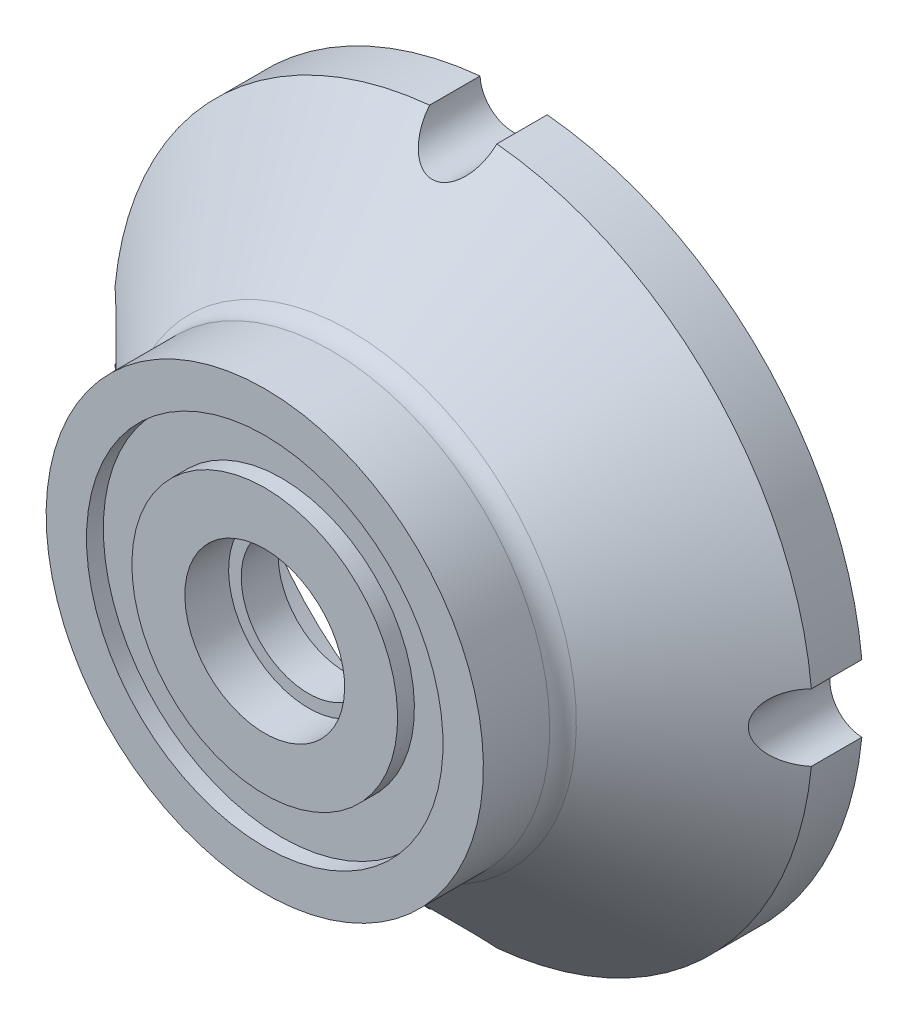
ISO-10303-21;
HEADER;
FILE_DESCRIPTION(('STEP AP214'),'2;1');
FILE_NAME('part.step','',(''),(''),'','','');
FILE_SCHEMA(('AUTOMOTIVE_DESIGN { 1 0 10303 214 1 1 1 1 }'));
ENDSEC;
DATA;
#1=APPLICATION_CONTEXT('core data for automotive mechanical design processes');
#2=APPLICATION_PROTOCOL_DEFINITION('international standard','automotive_design',2000,#1);
#3=PRODUCT_CONTEXT('',#1,'mechanical');
#4=PRODUCT('Part','Part','',(#3));
#5=PRODUCT_RELATED_PRODUCT_CATEGORY('part','',(#4));
#6=PRODUCT_DEFINITION_FORMATION('','',#4);
#7=PRODUCT_DEFINITION_CONTEXT('part definition',#1,'design');
#8=PRODUCT_DEFINITION('design','',#6,#7);
#9=PRODUCT_DEFINITION_SHAPE('','',#8);
#10=(LENGTH_UNIT() NAMED_UNIT(*) SI_UNIT(.MILLI.,.METRE.));
#11=(NAMED_UNIT(*) PLANE_ANGLE_UNIT() SI_UNIT($,.RADIAN.));
#12=(NAMED_UNIT(*) SI_UNIT($,.STERADIAN.) SOLID_ANGLE_UNIT());
#13=UNCERTAINTY_MEASURE_WITH_UNIT(LENGTH_MEASURE(1.E-05),#10,'distance_accuracy_value','');
#14=(GEOMETRIC_REPRESENTATION_CONTEXT(3) GLOBAL_UNCERTAINTY_ASSIGNED_CONTEXT((#13)) GLOBAL_UNIT_ASSIGNED_CONTEXT((#10,
#11,#12)) REPRESENTATION_CONTEXT('',''));
#15=CARTESIAN_POINT('',(0.,0.,0.));
#16=DIRECTION('',(0.,0.,1.));
#17=DIRECTION('',(1.,0.,0.));
#18=AXIS2_PLACEMENT_3D('',#15,#16,#17);
#19=CARTESIAN_POINT('',(0.,17.,0.));
#20=DIRECTION('',(0.,0.,-1.));
#21=DIRECTION('',(0.,1.,0.));
#22=AXIS2_PLACEMENT_3D('',#19,#20,#21);
#23=PLANE('',#22);
#24=CARTESIAN_POINT('',(0.,0.,0.));
#25=DIRECTION('',(0.,0.,-1.));
#26=DIRECTION('',(0.,1.,0.));
#27=AXIS2_PLACEMENT_3D('',#24,#25,#26);
#28=CIRCLE('',#27,17.);
#29=CARTESIAN_POINT('',(0.,17.,0.));
#30=VERTEX_POINT('',#29);
#31=EDGE_CURVE('E128',#30,#30,#28,.T.);
#32=ORIENTED_EDGE('',*,*,#31,.F.);
#33=EDGE_LOOP('',(#32));
#34=FACE_BOUND('',#33,.T.);
#35=CARTESIAN_POINT('',(0.,0.,0.));
#36=DIRECTION('',(0.,0.,-1.));
#37=DIRECTION('',(0.,1.,0.));
#38=AXIS2_PLACEMENT_3D('',#35,#36,#37);
#39=CIRCLE('',#38,20.8);
#40=CARTESIAN_POINT('',(-1.99768727229009,-20.7038461538462,0.));
#41=VERTEX_POINT('',#40);
#42=CARTESIAN_POINT('',(-20.7038461538462,-1.9976872722901,0.));
#43=VERTEX_POINT('',#42);
#44=EDGE_CURVE('E113',#41,#43,#39,.T.);
#45=ORIENTED_EDGE('',*,*,#44,.T.);
#46=CARTESIAN_POINT('',(-20.8,0.,0.));
#47=DIRECTION('',(0.,0.,1.));
#48=DIRECTION('',(1.,0.,0.));
#49=AXIS2_PLACEMENT_3D('',#46,#47,#48);
#50=CIRCLE('',#49,2.);
#51=CARTESIAN_POINT('',(-20.7038461538462,1.99768727229009,0.));
#52=VERTEX_POINT('',#51);
#53=EDGE_CURVE('E99',#43,#52,#50,.T.);
#54=ORIENTED_EDGE('',*,*,#53,.T.);
#55=CARTESIAN_POINT('',(-1.99768727229009,20.7038461538462,0.));
#56=VERTEX_POINT('',#55);
#57=EDGE_CURVE('E121',#52,#56,#39,.T.);
#58=ORIENTED_EDGE('',*,*,#57,.T.);
#59=CARTESIAN_POINT('',(0.,20.8,0.));
#60=DIRECTION('',(0.,0.,1.));
#61=DIRECTION('',(1.,0.,0.));
#62=AXIS2_PLACEMENT_3D('',#59,#60,#61);
#63=CIRCLE('',#62,2.);
#64=CARTESIAN_POINT('',(1.99768727229009,20.7038461538462,0.));
#65=VERTEX_POINT('',#64);
#66=EDGE_CURVE('E181',#56,#65,#63,.T.);
#67=ORIENTED_EDGE('',*,*,#66,.T.);
#68=CARTESIAN_POINT('',(20.7038461538462,1.99768727229009,0.));
#69=VERTEX_POINT('',#68);
#70=EDGE_CURVE('E123',#65,#69,#39,.T.);
#71=ORIENTED_EDGE('',*,*,#70,.T.);
#72=CARTESIAN_POINT('',(20.8,0.,0.));
#73=DIRECTION('',(0.,0.,1.));
#74=DIRECTION('',(1.,0.,0.));
#75=AXIS2_PLACEMENT_3D('',#72,#73,#74);
#76=CIRCLE('',#75,2.);
#77=CARTESIAN_POINT('',(20.7038461538462,-1.99768727229009,0.));
#78=VERTEX_POINT('',#77);
#79=EDGE_CURVE('E280',#69,#78,#76,.T.);
#80=ORIENTED_EDGE('',*,*,#79,.T.);
#81=CARTESIAN_POINT('',(1.99768727229009,-20.7038461538462,0.));
#82=VERTEX_POINT('',#81);
#83=EDGE_CURVE('E120',#78,#82,#39,.T.);
#84=ORIENTED_EDGE('',*,*,#83,.T.);
#85=CARTESIAN_POINT('',(0.,-20.8,0.));
#86=DIRECTION('',(0.,0.,1.));
#87=DIRECTION('',(1.,0.,0.));
#88=AXIS2_PLACEMENT_3D('',#85,#86,#87);
#89=CIRCLE('',#88,2.);
#90=EDGE_CURVE('E119',#82,#41,#89,.T.);
#91=ORIENTED_EDGE('',*,*,#90,.T.);
#92=EDGE_LOOP('',(#45,#54,#58,#67,#71,#80,#84,#91));
#93=FACE_BOUND('',#92,.T.);
#94=ADVANCED_FACE('F36',(#34,#93),#23,.T.);
#95=CARTESIAN_POINT('',(0.,0.,0.));
#96=DIRECTION('',(0.,0.,-1.));
#97=DIRECTION('',(0.,1.,0.));
#98=AXIS2_PLACEMENT_3D('',#95,#96,#97);
#99=CYLINDRICAL_SURFACE('',#98,20.8);
#100=ORIENTED_EDGE('',*,*,#57,.F.);
#101=DIRECTION('',(0.,0.,-1.));
#102=VECTOR('',#101,1.);
#103=CARTESIAN_POINT('',(-20.7038461538462,1.99768727229009,1.5));
#104=LINE('',#103,#102);
#105=CARTESIAN_POINT('',(-20.7038461538462,1.99768727229009,3.));
#106=VERTEX_POINT('',#105);
#107=EDGE_CURVE('E102',#106,#52,#104,.T.);
#108=ORIENTED_EDGE('',*,*,#107,.F.);
#109=CARTESIAN_POINT('',(0.,0.,3.));
#110=DIRECTION('',(0.,0.,-1.));
#111=DIRECTION('',(0.,1.,0.));
#112=AXIS2_PLACEMENT_3D('',#109,#110,#111);
#113=CIRCLE('',#112,20.8);
#114=CARTESIAN_POINT('',(-1.99768727229009,20.7038461538462,3.));
#115=VERTEX_POINT('',#114);
#116=EDGE_CURVE('E214',#106,#115,#113,.T.);
#117=ORIENTED_EDGE('',*,*,#116,.T.);
#118=DIRECTION('',(0.,0.,-1.));
#119=VECTOR('',#118,1.);
#120=CARTESIAN_POINT('',(-1.99768727229009,20.7038461538462,1.5));
#121=LINE('',#120,#119);
#122=EDGE_CURVE('E282',#56,#115,#121,.F.);
#123=ORIENTED_EDGE('',*,*,#122,.F.);
#124=EDGE_LOOP('',(#100,#108,#117,#123));
#125=FACE_BOUND('',#124,.T.);
#126=ADVANCED_FACE('F146',(#125),#99,.T.);
#127=CARTESIAN_POINT('',(-1.99768727229009,-20.7038461538462,2.99999999999999));
#128=VERTEX_POINT('',#127);
#129=CARTESIAN_POINT('',(-20.7038461538462,-1.9976872722901,3.));
#130=VERTEX_POINT('',#129);
#131=EDGE_CURVE('E115',#128,#130,#113,.T.);
#132=ORIENTED_EDGE('',*,*,#131,.T.);
#133=DIRECTION('',(0.,0.,-1.));
#134=VECTOR('',#133,1.);
#135=CARTESIAN_POINT('',(-20.7038461538462,-1.9976872722901,1.5));
#136=LINE('',#135,#134);
#137=EDGE_CURVE('E51',#43,#130,#136,.F.);
#138=ORIENTED_EDGE('',*,*,#137,.F.);
#139=ORIENTED_EDGE('',*,*,#44,.F.);
#140=DIRECTION('',(0.,0.,-1.));
#141=VECTOR('',#140,1.);
#142=CARTESIAN_POINT('',(-1.99768727229009,-20.7038461538462,1.49999999999999));
#143=LINE('',#142,#141);
#144=EDGE_CURVE('E256',#128,#41,#143,.T.);
#145=ORIENTED_EDGE('',*,*,#144,.F.);
#146=EDGE_LOOP('',(#132,#138,#139,#145));
#147=FACE_BOUND('',#146,.T.);
#148=ADVANCED_FACE('F111',(#147),#99,.T.);
#149=CARTESIAN_POINT('',(0.,0.,3.));
#150=DIRECTION('',(0.,0.,-1.));
#151=DIRECTION('',(0.,1.,0.));
#152=AXIS2_PLACEMENT_3D('',#149,#150,#151);
#153=CONICAL_SURFACE('',#152,20.8,0.825376850520738);
#154=CARTESIAN_POINT('',(0.,0.,9.75454168070733));
#155=DIRECTION('',(0.,0.,-1.));
#156=DIRECTION('',(0.,1.,0.));
#157=AXIS2_PLACEMENT_3D('',#154,#155,#156);
#158=CIRCLE('',#157,13.4825798459004);
#159=CARTESIAN_POINT('',(0.,13.4825798459004,9.75454168070733));
#160=VERTEX_POINT('',#159);
#161=EDGE_CURVE('E44',#160,#160,#158,.T.);
#162=ORIENTED_EDGE('',*,*,#161,.T.);
#163=EDGE_LOOP('',(#162));
#164=FACE_BOUND('',#163,.T.);
#165=ORIENTED_EDGE('',*,*,#116,.F.);
#166=CARTESIAN_POINT('',(-20.7040628216414,-1.99769768929351,2.99979999999988));
#167=CARTESIAN_POINT('',(-20.6423234101513,-1.99472479067877,3.05678797920817));
#168=CARTESIAN_POINT('',(-20.5807856851968,-1.98890831369218,3.11384678827432));
#169=CARTESIAN_POINT('',(-20.4583755671363,-1.97157901820399,3.22785604793121));
#170=CARTESIAN_POINT('',(-20.3975034171448,-1.96006418492685,3.2848064530388));
#171=CARTESIAN_POINT('',(-20.2762808754,-1.93122411643472,3.39873073057094));
#172=CARTESIAN_POINT('',(-20.2159377432615,-1.91385625667138,3.45570162042502));
#173=CARTESIAN_POINT('',(-20.0965722377513,-1.87327583124025,3.56890543829972));
#174=CARTESIAN_POINT('',(-20.0375497093545,-1.85006395556047,3.62513845261535));
#175=CARTESIAN_POINT('',(-19.8680144655603,-1.77378658498945,3.78738786029634));
#176=CARTESIAN_POINT('',(-19.7596229983857,-1.71279840853715,3.89204587578065));
#177=CARTESIAN_POINT('',(-19.5520388596017,-1.56798026172372,4.09411658067584));
#178=CARTESIAN_POINT('',(-19.4528226989133,-1.48421091056657,4.19154763705951));
#179=CARTESIAN_POINT('',(-19.2942419149139,-1.31975310301071,4.3484102573557));
#180=CARTESIAN_POINT('',(-19.2315896027621,-1.24502054119117,4.41074611743189));
#181=CARTESIAN_POINT('',(-19.1154827720173,-1.0827384537546,4.52680063936765));
#182=CARTESIAN_POINT('',(-19.0620158031844,-0.995206579828278,4.5805309587743));
#183=CARTESIAN_POINT('',(-18.9773730327602,-0.827577457426035,4.66590182247259));
#184=CARTESIAN_POINT('',(-18.9438743212939,-0.749820904137862,4.69981092709385));
#185=CARTESIAN_POINT('',(-18.8863080600481,-0.587517925823944,4.75820765335156));
#186=CARTESIAN_POINT('',(-18.8622340223379,-0.502976220167694,4.78270175604904));
#187=CARTESIAN_POINT('',(-18.8250956027797,-0.328294404026149,4.82053252989519));
#188=CARTESIAN_POINT('',(-18.8121196900427,-0.238115345994987,4.83377953841932));
#189=CARTESIAN_POINT('',(-18.798698886069,-0.0558771548957653,4.84748115356012));
#190=CARTESIAN_POINT('',(-18.7982460245694,0.0361807450458699,4.8479438966885));
#191=CARTESIAN_POINT('',(-18.8091474110555,0.207166391663922,4.83681382599125));
#192=CARTESIAN_POINT('',(-18.8190318348836,0.286296147201899,4.8267217591313));
#193=CARTESIAN_POINT('',(-18.8476788490582,0.441189355947289,4.79752261059754));
#194=CARTESIAN_POINT('',(-18.8664432031404,0.51695213713309,4.77841373800383));
#195=CARTESIAN_POINT('',(-18.912536790439,0.666185214739879,4.73158468099211));
#196=CARTESIAN_POINT('',(-18.9401467450416,0.739478312591064,4.70358256004766));
#197=CARTESIAN_POINT('',(-19.0023029575981,0.879881385781563,4.64073380637663));
#198=CARTESIAN_POINT('',(-19.0368526955397,0.946988234266243,4.60588373990617));
#199=CARTESIAN_POINT('',(-19.1325642413104,1.11039174584383,4.50967769130865));
#200=CARTESIAN_POINT('',(-19.1977990175731,1.20200905710495,4.44440218660916));
#201=CARTESIAN_POINT('',(-19.3382309842098,1.36938902333905,4.30477408645196));
#202=CARTESIAN_POINT('',(-19.4134542544447,1.44510878628785,4.23039777019588));
#203=CARTESIAN_POINT('',(-19.5998490087213,1.60619377580996,4.04735145064631));
#204=CARTESIAN_POINT('',(-19.7141210625072,1.68499445864494,3.93607188475805));
#205=CARTESIAN_POINT('',(-19.9512749630087,1.81604931058751,3.70736957177021));
#206=CARTESIAN_POINT('',(-20.0741638218788,1.86828156683718,3.58994184159066));
#207=CARTESIAN_POINT('',(-20.2821569299218,1.93373075021368,3.39311701050383));
#208=CARTESIAN_POINT('',(-20.3657837152277,1.9541834707449,3.31447222416467));
#209=CARTESIAN_POINT('',(-20.5341656401169,1.98408131828427,3.15710927358457));
#210=CARTESIAN_POINT('',(-20.6189135566512,1.99357813787402,3.0783932223058));
#211=CARTESIAN_POINT('',(-20.7040628216414,1.9976976892935,2.99979999999987));
#212=B_SPLINE_CURVE_WITH_KNOTS('',3,(#166,#167,#168,#169,#170,#171,#172,#173,#174,#175,#176,
#177,#178,#179,#180,#181,#182,#183,#184,#185,#186,#187,#188,#189,#190,#191,#192,#193,#194,#195,
#196,#197,#198,#199,#200,#201,#202,#203,#204,#205,#206,#207,#208,#209,#210,#211),.UNSPECIFIED.,
.F.,.F.,(4,2,2,2,2,2,2,2,2,2,2,2,2,2,2,2,2,2,2,2,2,2,4),(0.,0.252169415062769,0.504428053777322,
0.758564952672955,1.01267186033474,1.49847297536855,1.98299384460009,2.3291035942886,
2.67474044454704,2.94730289739613,3.21967738734604,3.49420340545444,3.76855469818095,
4.00858834994238,4.24866969732025,4.4972844215902,4.74602412755156,5.13395487578811,
5.5229191907289,6.05383308119859,6.58518414671709,6.93451241536415,7.28218563970306),.UNSPECIFIED.);
#213=EDGE_CURVE('E106',#130,#106,#212,.T.);
#214=ORIENTED_EDGE('',*,*,#213,.F.);
#215=ORIENTED_EDGE('',*,*,#131,.F.);
#216=CARTESIAN_POINT('',(1.9976976892935,-20.7040628216414,2.99979999999988));
#217=CARTESIAN_POINT('',(1.99472479067877,-20.6423234101513,3.05678797920817));
#218=CARTESIAN_POINT('',(1.98890831369218,-20.5807856851968,3.11384678827433));
#219=CARTESIAN_POINT('',(1.97157901820398,-20.4583755671363,3.22785604793121));
#220=CARTESIAN_POINT('',(1.96006418492684,-20.3975034171448,3.2848064530388));
#221=CARTESIAN_POINT('',(1.93122411643472,-20.2762808754,3.39873073057094));
#222=CARTESIAN_POINT('',(1.91385625667137,-20.2159377432615,3.45570162042502));
#223=CARTESIAN_POINT('',(1.87327583124024,-20.0965722377513,3.56890543829972));
#224=CARTESIAN_POINT('',(1.85006395556046,-20.0375497093545,3.62513845261535));
#225=CARTESIAN_POINT('',(1.77378658498944,-19.8680144655603,3.78738786029634));
#226=CARTESIAN_POINT('',(1.71279840853715,-19.7596229983857,3.89204587578065));
#227=CARTESIAN_POINT('',(1.56798026172372,-19.5520388596017,4.09411658067584));
#228=CARTESIAN_POINT('',(1.48421091056656,-19.4528226989133,4.19154763705951));
#229=CARTESIAN_POINT('',(1.31975310301071,-19.2942419149139,4.34841025735569));
#230=CARTESIAN_POINT('',(1.24502054119116,-19.2315896027621,4.41074611743188));
#231=CARTESIAN_POINT('',(1.08273845375459,-19.1154827720173,4.52680063936764));
#232=CARTESIAN_POINT('',(0.995206579828275,-19.0620158031844,4.58053095877429));
#233=CARTESIAN_POINT('',(0.827577457426032,-18.9773730327602,4.66590182247258));
#234=CARTESIAN_POINT('',(0.749820904137859,-18.9438743212939,4.69981092709385));
#235=CARTESIAN_POINT('',(0.58751792582394,-18.8863080600481,4.75820765335155));
#236=CARTESIAN_POINT('',(0.502976220167691,-18.8622340223379,4.78270175604903));
#237=CARTESIAN_POINT('',(0.328294404026147,-18.8250956027797,4.82053252989519));
#238=CARTESIAN_POINT('',(0.238115345994985,-18.8121196900427,4.83377953841932));
#239=CARTESIAN_POINT('',(0.0558771548957623,-18.798698886069,4.84748115356011));
#240=CARTESIAN_POINT('',(-0.0361807450458734,-18.7982460245694,4.84794389668849));
#241=CARTESIAN_POINT('',(-0.207166391663926,-18.8091474110555,4.83681382599124));
#242=CARTESIAN_POINT('',(-0.286296147201903,-18.8190318348836,4.8267217591313));
#243=CARTESIAN_POINT('',(-0.441189355947292,-18.8476788490582,4.79752261059753));
#244=CARTESIAN_POINT('',(-0.516952137133093,-18.8664432031404,4.77841373800382));
#245=CARTESIAN_POINT('',(-0.666185214739881,-18.9125367904391,4.73158468099211));
#246=CARTESIAN_POINT('',(-0.739478312591066,-18.9401467450416,4.70358256004766));
#247=CARTESIAN_POINT('',(-0.879881385781565,-19.0023029575981,4.64073380637663));
#248=CARTESIAN_POINT('',(-0.946988234266244,-19.0368526955397,4.60588373990616));
#249=CARTESIAN_POINT('',(-1.11039174584383,-19.1325642413104,4.50967769130864));
#250=CARTESIAN_POINT('',(-1.20200905710495,-19.1977990175731,4.44440218660915));
#251=CARTESIAN_POINT('',(-1.36938902333905,-19.3382309842098,4.30477408645195));
#252=CARTESIAN_POINT('',(-1.44510878628785,-19.4134542544447,4.23039777019587));
#253=CARTESIAN_POINT('',(-1.60619377580996,-19.5998490087213,4.0473514506463));
#254=CARTESIAN_POINT('',(-1.68499445864495,-19.7141210625072,3.93607188475804));
#255=CARTESIAN_POINT('',(-1.81604931058751,-19.9512749630087,3.7073695717702));
#256=CARTESIAN_POINT('',(-1.86828156683718,-20.0741638218789,3.58994184159065));
#257=CARTESIAN_POINT('',(-1.93373075021368,-20.2821569299218,3.39311701050382));
#258=CARTESIAN_POINT('',(-1.9541834707449,-20.3657837152277,3.31447222416466));
#259=CARTESIAN_POINT('',(-1.98408131828427,-20.5341656401169,3.15710927358456));
#260=CARTESIAN_POINT('',(-1.99357813787402,-20.6189135566512,3.0783932223058));
#261=CARTESIAN_POINT('',(-1.9976976892935,-20.7040628216414,2.99979999999987));
#262=B_SPLINE_CURVE_WITH_KNOTS('',3,(#216,#217,#218,#219,#220,#221,#222,#223,#224,#225,#226,
#227,#228,#229,#230,#231,#232,#233,#234,#235,#236,#237,#238,#239,#240,#241,#242,#243,#244,#245,
#246,#247,#248,#249,#250,#251,#252,#253,#254,#255,#256,#257,#258,#259,#260,#261),.UNSPECIFIED.,
.F.,.F.,(4,2,2,2,2,2,2,2,2,2,2,2,2,2,2,2,2,2,2,2,2,2,4),(0.,0.25216941506277,0.504428053777323,
0.758564952672958,1.01267186033474,1.49847297536855,1.98299384460009,2.3291035942886,
2.67474044454703,2.94730289739612,3.21967738734604,3.49420340545443,3.76855469818094,
4.00858834994237,4.24866969732024,4.4972844215902,4.74602412755155,5.1339548757881,
5.52291919072889,6.05383308119858,6.58518414671709,6.93451241536414,7.28218563970304),.UNSPECIFIED.);
#263=CARTESIAN_POINT('',(1.99768727229009,-20.7038461538462,2.99999999999999));
#264=VERTEX_POINT('',#263);
#265=EDGE_CURVE('E233',#264,#128,#262,.T.);
#266=ORIENTED_EDGE('',*,*,#265,.F.);
#267=CARTESIAN_POINT('',(20.7038461538462,-1.99768727229009,3.));
#268=VERTEX_POINT('',#267);
#269=EDGE_CURVE('E220',#268,#264,#113,.T.);
#270=ORIENTED_EDGE('',*,*,#269,.F.);
#271=CARTESIAN_POINT('',(20.7040628216414,1.99769768929351,2.99979999999988));
#272=CARTESIAN_POINT('',(20.6423234101513,1.99472479067877,3.05678797920817));
#273=CARTESIAN_POINT('',(20.5807856851968,1.98890831369218,3.11384678827433));
#274=CARTESIAN_POINT('',(20.4583755671363,1.97157901820399,3.22785604793121));
#275=CARTESIAN_POINT('',(20.3975034171448,1.96006418492685,3.2848064530388));
#276=CARTESIAN_POINT('',(20.2762808754,1.93122411643472,3.39873073057094));
#277=CARTESIAN_POINT('',(20.2159377432615,1.91385625667138,3.45570162042502));
#278=CARTESIAN_POINT('',(20.0965722377513,1.87327583124024,3.56890543829972));
#279=CARTESIAN_POINT('',(20.0375497093545,1.85006395556047,3.62513845261535));
#280=CARTESIAN_POINT('',(19.8680144655603,1.77378658498944,3.78738786029634));
#281=CARTESIAN_POINT('',(19.7596229983857,1.71279840853715,3.89204587578065));
#282=CARTESIAN_POINT('',(19.5520388596017,1.56798026172372,4.09411658067584));
#283=CARTESIAN_POINT('',(19.4528226989133,1.48421091056656,4.19154763705951));
#284=CARTESIAN_POINT('',(19.2942419149139,1.31975310301071,4.3484102573557));
#285=CARTESIAN_POINT('',(19.2315896027621,1.24502054119116,4.41074611743188));
#286=CARTESIAN_POINT('',(19.1154827720173,1.08273845375459,4.52680063936765));
#287=CARTESIAN_POINT('',(19.0620158031844,0.995206579828276,4.5805309587743));
#288=CARTESIAN_POINT('',(18.9773730327602,0.827577457426033,4.66590182247259));
#289=CARTESIAN_POINT('',(18.9438743212939,0.749820904137859,4.69981092709385));
#290=CARTESIAN_POINT('',(18.8863080600481,0.587517925823941,4.75820765335156));
#291=CARTESIAN_POINT('',(18.8622340223379,0.502976220167693,4.78270175604904));
#292=CARTESIAN_POINT('',(18.8250956027797,0.328294404026149,4.82053252989519));
#293=CARTESIAN_POINT('',(18.8121196900427,0.238115345994986,4.83377953841932));
#294=CARTESIAN_POINT('',(18.798698886069,0.0558771548957641,4.84748115356012));
#295=CARTESIAN_POINT('',(18.7982460245694,-0.0361807450458712,4.8479438966885));
#296=CARTESIAN_POINT('',(18.8091474110555,-0.207166391663923,4.83681382599125));
#297=CARTESIAN_POINT('',(18.8190318348836,-0.2862961472019,4.8267217591313));
#298=CARTESIAN_POINT('',(18.8476788490582,-0.44118935594729,4.79752261059754));
#299=CARTESIAN_POINT('',(18.8664432031404,-0.516952137133091,4.77841373800383));
#300=CARTESIAN_POINT('',(18.912536790439,-0.66618521473988,4.73158468099211));
#301=CARTESIAN_POINT('',(18.9401467450416,-0.739478312591065,4.70358256004766));
#302=CARTESIAN_POINT('',(19.0023029575981,-0.879881385781564,4.64073380637663));
#303=CARTESIAN_POINT('',(19.0368526955397,-0.946988234266243,4.60588373990617));
#304=CARTESIAN_POINT('',(19.1325642413104,-1.11039174584383,4.50967769130865));
#305=CARTESIAN_POINT('',(19.1977990175731,-1.20200905710495,4.44440218660916));
#306=CARTESIAN_POINT('',(19.3382309842098,-1.36938902333905,4.30477408645196));
#307=CARTESIAN_POINT('',(19.4134542544447,-1.44510878628785,4.23039777019588));
#308=CARTESIAN_POINT('',(19.5998490087213,-1.60619377580996,4.04735145064631));
#309=CARTESIAN_POINT('',(19.7141210625072,-1.68499445864495,3.93607188475805));
#310=CARTESIAN_POINT('',(19.9512749630087,-1.81604931058751,3.70736957177021));
#311=CARTESIAN_POINT('',(20.0741638218788,-1.86828156683718,3.58994184159066));
#312=CARTESIAN_POINT('',(20.2821569299218,-1.93373075021368,3.39311701050383));
#313=CARTESIAN_POINT('',(20.3657837152277,-1.9541834707449,3.31447222416467));
#314=CARTESIAN_POINT('',(20.5341656401169,-1.98408131828428,3.15710927358457));
#315=CARTESIAN_POINT('',(20.6189135566512,-1.99357813787402,3.0783932223058));
#316=CARTESIAN_POINT('',(20.7040628216414,-1.9976976892935,2.99979999999987));
#317=B_SPLINE_CURVE_WITH_KNOTS('',3,(#271,#272,#273,#274,#275,#276,#277,#278,#279,#280,#281,
#282,#283,#284,#285,#286,#287,#288,#289,#290,#291,#292,#293,#294,#295,#296,#297,#298,#299,#300,
#301,#302,#303,#304,#305,#306,#307,#308,#309,#310,#311,#312,#313,#314,#315,#316),.UNSPECIFIED.,
.F.,.F.,(4,2,2,2,2,2,2,2,2,2,2,2,2,2,2,2,2,2,2,2,2,2,4),(0.,0.252169415062768,0.504428053777322,
0.758564952672955,1.01267186033474,1.49847297536855,1.98299384460009,2.3291035942886,
2.67474044454704,2.94730289739613,3.21967738734604,3.49420340545444,3.76855469818095,
4.00858834994238,4.24866969732024,4.4972844215902,4.74602412755156,5.1339548757881,
5.5229191907289,6.05383308119859,6.58518414671709,6.93451241536414,7.28218563970306),.UNSPECIFIED.);
#318=CARTESIAN_POINT('',(20.7038461538462,1.99768727229009,3.));
#319=VERTEX_POINT('',#318);
#320=EDGE_CURVE('E232',#319,#268,#317,.T.);
#321=ORIENTED_EDGE('',*,*,#320,.F.);
#322=CARTESIAN_POINT('',(1.99768727229009,20.7038461538462,3.));
#323=VERTEX_POINT('',#322);
#324=EDGE_CURVE('E124',#323,#319,#113,.T.);
#325=ORIENTED_EDGE('',*,*,#324,.F.);
#326=CARTESIAN_POINT('',(-1.9976976892935,20.7040628216414,2.99979999999988));
#327=CARTESIAN_POINT('',(-1.99472479067876,20.6423234101513,3.05678797920817));
#328=CARTESIAN_POINT('',(-1.98890831369217,20.5807856851968,3.11384678827433));
#329=CARTESIAN_POINT('',(-1.97157901820398,20.4583755671363,3.22785604793121));
#330=CARTESIAN_POINT('',(-1.96006418492684,20.3975034171448,3.2848064530388));
#331=CARTESIAN_POINT('',(-1.93122411643472,20.2762808754,3.39873073057094));
#332=CARTESIAN_POINT('',(-1.91385625667137,20.2159377432615,3.45570162042503));
#333=CARTESIAN_POINT('',(-1.87327583124024,20.0965722377513,3.56890543829973));
#334=CARTESIAN_POINT('',(-1.85006395556046,20.0375497093545,3.62513845261535));
#335=CARTESIAN_POINT('',(-1.77378658498944,19.8680144655603,3.78738786029634));
#336=CARTESIAN_POINT('',(-1.71279840853715,19.7596229983857,3.89204587578065));
#337=CARTESIAN_POINT('',(-1.56798026172372,19.5520388596017,4.09411658067584));
#338=CARTESIAN_POINT('',(-1.48421091056656,19.4528226989133,4.19154763705951));
#339=CARTESIAN_POINT('',(-1.3197531030107,19.2942419149139,4.3484102573557));
#340=CARTESIAN_POINT('',(-1.24502054119116,19.2315896027621,4.41074611743189));
#341=CARTESIAN_POINT('',(-1.08273845375459,19.1154827720173,4.52680063936765));
#342=CARTESIAN_POINT('',(-0.995206579828273,19.0620158031844,4.5805309587743));
#343=CARTESIAN_POINT('',(-0.82757745742603,18.9773730327602,4.66590182247259));
#344=CARTESIAN_POINT('',(-0.749820904137857,18.9438743212939,4.69981092709385));
#345=CARTESIAN_POINT('',(-0.587517925823938,18.8863080600481,4.75820765335156));
#346=CARTESIAN_POINT('',(-0.50297622016769,18.8622340223379,4.78270175604904));
#347=CARTESIAN_POINT('',(-0.328294404026145,18.8250956027797,4.82053252989519));
#348=CARTESIAN_POINT('',(-0.238115345994983,18.8121196900427,4.83377953841932));
#349=CARTESIAN_POINT('',(-0.055877154895761,18.798698886069,4.84748115356012));
#350=CARTESIAN_POINT('',(0.0361807450458744,18.7982460245694,4.8479438966885));
#351=CARTESIAN_POINT('',(0.207166391663927,18.8091474110555,4.83681382599125));
#352=CARTESIAN_POINT('',(0.286296147201903,18.8190318348836,4.8267217591313));
#353=CARTESIAN_POINT('',(0.441189355947293,18.8476788490582,4.79752261059754));
#354=CARTESIAN_POINT('',(0.516952137133094,18.8664432031404,4.77841373800383));
#355=CARTESIAN_POINT('',(0.666185214739883,18.912536790439,4.73158468099211));
#356=CARTESIAN_POINT('',(0.739478312591067,18.9401467450416,4.70358256004766));
#357=CARTESIAN_POINT('',(0.879881385781566,19.0023029575981,4.64073380637663));
#358=CARTESIAN_POINT('',(0.946988234266245,19.0368526955397,4.60588373990617));
#359=CARTESIAN_POINT('',(1.11039174584383,19.1325642413104,4.50967769130865));
#360=CARTESIAN_POINT('',(1.20200905710495,19.1977990175731,4.44440218660916));
#361=CARTESIAN_POINT('',(1.36938902333905,19.3382309842098,4.30477408645196));
#362=CARTESIAN_POINT('',(1.44510878628785,19.4134542544447,4.23039777019588));
#363=CARTESIAN_POINT('',(1.60619377580996,19.5998490087213,4.04735145064631));
#364=CARTESIAN_POINT('',(1.68499445864495,19.7141210625072,3.93607188475805));
#365=CARTESIAN_POINT('',(1.81604931058751,19.9512749630087,3.70736957177021));
#366=CARTESIAN_POINT('',(1.86828156683718,20.0741638218788,3.58994184159066));
#367=CARTESIAN_POINT('',(1.93373075021368,20.2821569299218,3.39311701050383));
#368=CARTESIAN_POINT('',(1.9541834707449,20.3657837152277,3.31447222416467));
#369=CARTESIAN_POINT('',(1.98408131828428,20.5341656401169,3.15710927358456));
#370=CARTESIAN_POINT('',(1.99357813787402,20.6189135566512,3.0783932223058));
#371=CARTESIAN_POINT('',(1.9976976892935,20.7040628216414,2.99979999999987));
#372=B_SPLINE_CURVE_WITH_KNOTS('',3,(#326,#327,#328,#329,#330,#331,#332,#333,#334,#335,#336,
#337,#338,#339,#340,#341,#342,#343,#344,#345,#346,#347,#348,#349,#350,#351,#352,#353,#354,#355,
#356,#357,#358,#359,#360,#361,#362,#363,#364,#365,#366,#367,#368,#369,#370,#371),.UNSPECIFIED.,
.F.,.F.,(4,2,2,2,2,2,2,2,2,2,2,2,2,2,2,2,2,2,2,2,2,2,4),(0.,0.252169415062771,0.504428053777322,
0.758564952672956,1.01267186033474,1.49847297536855,1.98299384460009,2.3291035942886,
2.67474044454704,2.94730289739613,3.21967738734604,3.49420340545444,3.76855469818095,
4.00858834994238,4.24866969732024,4.4972844215902,4.74602412755156,5.1339548757881,
5.52291919072889,6.05383308119858,6.58518414671709,6.93451241536414,7.28218563970306),.UNSPECIFIED.);
#373=EDGE_CURVE('E176',#115,#323,#372,.T.);
#374=ORIENTED_EDGE('',*,*,#373,.F.);
#375=EDGE_LOOP('',(#165,#214,#215,#266,#270,#321,#325,#374));
#376=FACE_BOUND('',#375,.T.);
#377=ADVANCED_FACE('F134',(#164,#376),#153,.T.);
#378=ORIENTED_EDGE('',*,*,#269,.T.);
#379=DIRECTION('',(0.,0.,-1.));
#380=VECTOR('',#379,1.);
#381=CARTESIAN_POINT('',(1.99768727229009,-20.7038461538462,1.49999999999999));
#382=LINE('',#381,#380);
#383=EDGE_CURVE('E59',#82,#264,#382,.F.);
#384=ORIENTED_EDGE('',*,*,#383,.F.);
#385=ORIENTED_EDGE('',*,*,#83,.F.);
#386=DIRECTION('',(0.,0.,-1.));
#387=VECTOR('',#386,1.);
#388=CARTESIAN_POINT('',(20.7038461538462,-1.99768727229009,1.5));
#389=LINE('',#388,#387);
#390=EDGE_CURVE('E230',#268,#78,#389,.T.);
#391=ORIENTED_EDGE('',*,*,#390,.F.);
#392=EDGE_LOOP('',(#378,#384,#385,#391));
#393=FACE_BOUND('',#392,.T.);
#394=ADVANCED_FACE('F168',(#393),#99,.T.);
#395=ORIENTED_EDGE('',*,*,#324,.T.);
#396=DIRECTION('',(0.,0.,-1.));
#397=VECTOR('',#396,1.);
#398=CARTESIAN_POINT('',(20.7038461538462,1.99768727229009,1.5));
#399=LINE('',#398,#397);
#400=EDGE_CURVE('E235',#69,#319,#399,.F.);
#401=ORIENTED_EDGE('',*,*,#400,.F.);
#402=ORIENTED_EDGE('',*,*,#70,.F.);
#403=DIRECTION('',(0.,0.,-1.));
#404=VECTOR('',#403,1.);
#405=CARTESIAN_POINT('',(1.99768727229009,20.7038461538462,1.5));
#406=LINE('',#405,#404);
#407=EDGE_CURVE('E279',#323,#65,#406,.T.);
#408=ORIENTED_EDGE('',*,*,#407,.F.);
#409=EDGE_LOOP('',(#395,#401,#402,#408));
#410=FACE_BOUND('',#409,.T.);
#411=ADVANCED_FACE('F154',(#410),#99,.T.);
#412=CARTESIAN_POINT('',(0.,0.,0.));
#413=DIRECTION('',(0.,0.,-1.));
#414=DIRECTION('',(0.,1.,0.));
#415=AXIS2_PLACEMENT_3D('',#412,#413,#414);
#416=CYLINDRICAL_SURFACE('',#415,17.);
#417=ORIENTED_EDGE('',*,*,#31,.T.);
#418=EDGE_LOOP('',(#417));
#419=FACE_BOUND('',#418,.T.);
#420=CARTESIAN_POINT('',(0.,0.,4.2));
#421=DIRECTION('',(0.,0.,-1.));
#422=DIRECTION('',(0.,1.,0.));
#423=AXIS2_PLACEMENT_3D('',#420,#421,#422);
#424=CIRCLE('',#423,17.);
#425=CARTESIAN_POINT('',(0.,17.,4.2));
#426=VERTEX_POINT('',#425);
#427=EDGE_CURVE('E173',#426,#426,#424,.T.);
#428=ORIENTED_EDGE('',*,*,#427,.F.);
#429=EDGE_LOOP('',(#428));
#430=FACE_BOUND('',#429,.T.);
#431=ADVANCED_FACE('F157',(#419,#430),#416,.F.);
#432=CARTESIAN_POINT('',(0.,0.,0.));
#433=DIRECTION('',(0.,0.,-1.));
#434=DIRECTION('',(0.,1.,0.));
#435=AXIS2_PLACEMENT_3D('',#432,#433,#434);
#436=CYLINDRICAL_SURFACE('',#435,13.);
#437=CARTESIAN_POINT('',(0.,0.,10.8567468476486));
#438=DIRECTION('',(0.,0.,-1.));
#439=DIRECTION('',(0.,1.,0.));
#440=AXIS2_PLACEMENT_3D('',#437,#438,#439);
#441=CIRCLE('',#440,13.);
#442=CARTESIAN_POINT('',(0.,13.,10.8567468476486));
#443=VERTEX_POINT('',#442);
#444=EDGE_CURVE('E11',#443,#443,#441,.F.);
#445=ORIENTED_EDGE('',*,*,#444,.T.);
#446=EDGE_LOOP('',(#445));
#447=FACE_BOUND('',#446,.T.);
#448=CARTESIAN_POINT('',(0.,0.,14.8));
#449=DIRECTION('',(0.,0.,-1.));
#450=DIRECTION('',(0.,1.,0.));
#451=AXIS2_PLACEMENT_3D('',#448,#449,#450);
#452=CIRCLE('',#451,13.);
#453=CARTESIAN_POINT('',(0.,13.,14.8));
#454=VERTEX_POINT('',#453);
#455=EDGE_CURVE('E212',#454,#454,#452,.T.);
#456=ORIENTED_EDGE('',*,*,#455,.T.);
#457=EDGE_LOOP('',(#456));
#458=FACE_BOUND('',#457,.T.);
#459=ADVANCED_FACE('F159',(#447,#458),#436,.T.);
#460=CARTESIAN_POINT('',(0.,13.,14.8));
#461=DIRECTION('',(0.,0.,1.));
#462=DIRECTION('',(0.,-1.,0.));
#463=AXIS2_PLACEMENT_3D('',#460,#461,#462);
#464=PLANE('',#463);
#465=CARTESIAN_POINT('',(0.,0.,14.8));
#466=DIRECTION('',(0.,0.,-1.));
#467=DIRECTION('',(0.,1.,0.));
#468=AXIS2_PLACEMENT_3D('',#465,#466,#467);
#469=CIRCLE('',#468,10.6);
#470=CARTESIAN_POINT('',(0.,10.6,14.8));
#471=VERTEX_POINT('',#470);
#472=EDGE_CURVE('E210',#471,#471,#469,.T.);
#473=ORIENTED_EDGE('',*,*,#472,.T.);
#474=EDGE_LOOP('',(#473));
#475=FACE_BOUND('',#474,.T.);
#476=ORIENTED_EDGE('',*,*,#455,.F.);
#477=EDGE_LOOP('',(#476));
#478=FACE_BOUND('',#477,.T.);
#479=ADVANCED_FACE('F165',(#475,#478),#464,.T.);
#480=CARTESIAN_POINT('',(0.,0.,0.));
#481=DIRECTION('',(0.,0.,-1.));
#482=DIRECTION('',(0.,1.,0.));
#483=AXIS2_PLACEMENT_3D('',#480,#481,#482);
#484=CYLINDRICAL_SURFACE('',#483,10.6);
#485=CARTESIAN_POINT('',(0.,0.,13.8));
#486=DIRECTION('',(0.,0.,-1.));
#487=DIRECTION('',(0.,1.,0.));
#488=AXIS2_PLACEMENT_3D('',#485,#486,#487);
#489=CIRCLE('',#488,10.6);
#490=CARTESIAN_POINT('',(0.,10.6,13.8));
#491=VERTEX_POINT('',#490);
#492=EDGE_CURVE('E207',#491,#491,#489,.T.);
#493=ORIENTED_EDGE('',*,*,#492,.T.);
#494=EDGE_LOOP('',(#493));
#495=FACE_BOUND('',#494,.T.);
#496=ORIENTED_EDGE('',*,*,#472,.F.);
#497=EDGE_LOOP('',(#496));
#498=FACE_BOUND('',#497,.T.);
#499=ADVANCED_FACE('F320',(#495,#498),#484,.F.);
#500=CARTESIAN_POINT('',(0.,10.6,13.8));
#501=DIRECTION('',(0.,0.,1.));
#502=DIRECTION('',(0.,-1.,0.));
#503=AXIS2_PLACEMENT_3D('',#500,#501,#502);
#504=PLANE('',#503);
#505=CARTESIAN_POINT('',(0.,0.,13.8));
#506=DIRECTION('',(0.,0.,-1.));
#507=DIRECTION('',(0.,1.,0.));
#508=AXIS2_PLACEMENT_3D('',#505,#506,#507);
#509=CIRCLE('',#508,7.9);
#510=CARTESIAN_POINT('',(0.,7.9,13.8));
#511=VERTEX_POINT('',#510);
#512=EDGE_CURVE('E204',#511,#511,#509,.T.);
#513=ORIENTED_EDGE('',*,*,#512,.T.);
#514=EDGE_LOOP('',(#513));
#515=FACE_BOUND('',#514,.T.);
#516=ORIENTED_EDGE('',*,*,#492,.F.);
#517=EDGE_LOOP('',(#516));
#518=FACE_BOUND('',#517,.T.);
#519=ADVANCED_FACE('F316',(#515,#518),#504,.T.);
#520=CARTESIAN_POINT('',(0.,0.,0.));
#521=DIRECTION('',(0.,0.,-1.));
#522=DIRECTION('',(0.,1.,0.));
#523=AXIS2_PLACEMENT_3D('',#520,#521,#522);
#524=CYLINDRICAL_SURFACE('',#523,7.9);
#525=CARTESIAN_POINT('',(0.,0.,14.8));
#526=DIRECTION('',(0.,0.,-1.));
#527=DIRECTION('',(0.,1.,0.));
#528=AXIS2_PLACEMENT_3D('',#525,#526,#527);
#529=CIRCLE('',#528,7.9);
#530=CARTESIAN_POINT('',(0.,7.9,14.8));
#531=VERTEX_POINT('',#530);
#532=EDGE_CURVE('E201',#531,#531,#529,.T.);
#533=ORIENTED_EDGE('',*,*,#532,.T.);
#534=EDGE_LOOP('',(#533));
#535=FACE_BOUND('',#534,.T.);
#536=ORIENTED_EDGE('',*,*,#512,.F.);
#537=EDGE_LOOP('',(#536));
#538=FACE_BOUND('',#537,.T.);
#539=ADVANCED_FACE('F312',(#535,#538),#524,.T.);
#540=CARTESIAN_POINT('',(0.,7.9,14.8));
#541=DIRECTION('',(0.,0.,1.));
#542=DIRECTION('',(0.,-1.,0.));
#543=AXIS2_PLACEMENT_3D('',#540,#541,#542);
#544=PLANE('',#543);
#545=CARTESIAN_POINT('',(0.,0.,14.8));
#546=DIRECTION('',(0.,0.,-1.));
#547=DIRECTION('',(0.,1.,0.));
#548=AXIS2_PLACEMENT_3D('',#545,#546,#547);
#549=CIRCLE('',#548,4.75);
#550=CARTESIAN_POINT('',(0.,4.75,14.8));
#551=VERTEX_POINT('',#550);
#552=EDGE_CURVE('E198',#551,#551,#549,.T.);
#553=ORIENTED_EDGE('',*,*,#552,.T.);
#554=EDGE_LOOP('',(#553));
#555=FACE_BOUND('',#554,.T.);
#556=ORIENTED_EDGE('',*,*,#532,.F.);
#557=EDGE_LOOP('',(#556));
#558=FACE_BOUND('',#557,.T.);
#559=ADVANCED_FACE('F308',(#555,#558),#544,.T.);
#560=CARTESIAN_POINT('',(0.,0.,0.));
#561=DIRECTION('',(0.,0.,-1.));
#562=DIRECTION('',(0.,1.,0.));
#563=AXIS2_PLACEMENT_3D('',#560,#561,#562);
#564=CYLINDRICAL_SURFACE('',#563,4.75);
#565=CARTESIAN_POINT('',(0.,0.,12.2));
#566=DIRECTION('',(0.,0.,-1.));
#567=DIRECTION('',(0.,1.,0.));
#568=AXIS2_PLACEMENT_3D('',#565,#566,#567);
#569=CIRCLE('',#568,4.75);
#570=CARTESIAN_POINT('',(0.,4.75,12.2));
#571=VERTEX_POINT('',#570);
#572=EDGE_CURVE('E195',#571,#571,#569,.T.);
#573=ORIENTED_EDGE('',*,*,#572,.T.);
#574=EDGE_LOOP('',(#573));
#575=FACE_BOUND('',#574,.T.);
#576=ORIENTED_EDGE('',*,*,#552,.F.);
#577=EDGE_LOOP('',(#576));
#578=FACE_BOUND('',#577,.T.);
#579=ADVANCED_FACE('F304',(#575,#578),#564,.F.);
#580=CARTESIAN_POINT('',(0.,4.75,12.2));
#581=DIRECTION('',(0.,0.,1.));
#582=DIRECTION('',(0.,-1.,0.));
#583=AXIS2_PLACEMENT_3D('',#580,#581,#582);
#584=PLANE('',#583);
#585=CARTESIAN_POINT('',(0.,0.,12.2));
#586=DIRECTION('',(0.,0.,-1.));
#587=DIRECTION('',(0.,1.,0.));
#588=AXIS2_PLACEMENT_3D('',#585,#586,#587);
#589=CIRCLE('',#588,4.);
#590=CARTESIAN_POINT('',(0.,4.,12.2));
#591=VERTEX_POINT('',#590);
#592=EDGE_CURVE('E192',#591,#591,#589,.T.);
#593=ORIENTED_EDGE('',*,*,#592,.T.);
#594=EDGE_LOOP('',(#593));
#595=FACE_BOUND('',#594,.T.);
#596=ORIENTED_EDGE('',*,*,#572,.F.);
#597=EDGE_LOOP('',(#596));
#598=FACE_BOUND('',#597,.T.);
#599=ADVANCED_FACE('F300',(#595,#598),#584,.T.);
#600=CARTESIAN_POINT('',(0.,0.,0.));
#601=DIRECTION('',(0.,0.,-1.));
#602=DIRECTION('',(0.,1.,0.));
#603=AXIS2_PLACEMENT_3D('',#600,#601,#602);
#604=CYLINDRICAL_SURFACE('',#603,4.);
#605=CARTESIAN_POINT('',(0.,0.,10.));
#606=DIRECTION('',(0.,0.,-1.));
#607=DIRECTION('',(0.,1.,0.));
#608=AXIS2_PLACEMENT_3D('',#605,#606,#607);
#609=CIRCLE('',#608,4.);
#610=CARTESIAN_POINT('',(0.,4.,10.));
#611=VERTEX_POINT('',#610);
#612=EDGE_CURVE('E179',#611,#611,#609,.T.);
#613=ORIENTED_EDGE('',*,*,#612,.T.);
#614=EDGE_LOOP('',(#613));
#615=FACE_BOUND('',#614,.T.);
#616=ORIENTED_EDGE('',*,*,#592,.F.);
#617=EDGE_LOOP('',(#616));
#618=FACE_BOUND('',#617,.T.);
#619=ADVANCED_FACE('F296',(#615,#618),#604,.F.);
#620=CARTESIAN_POINT('',(0.,4.,10.));
#621=DIRECTION('',(0.,0.,-1.));
#622=DIRECTION('',(0.,1.,0.));
#623=AXIS2_PLACEMENT_3D('',#620,#621,#622);
#624=PLANE('',#623);
#625=CARTESIAN_POINT('',(0.,0.,10.));
#626=DIRECTION('',(0.,0.,-1.));
#627=DIRECTION('',(0.,1.,0.));
#628=AXIS2_PLACEMENT_3D('',#625,#626,#627);
#629=CIRCLE('',#628,11.2);
#630=CARTESIAN_POINT('',(0.,11.2,10.));
#631=VERTEX_POINT('',#630);
#632=EDGE_CURVE('E175',#631,#631,#629,.T.);
#633=ORIENTED_EDGE('',*,*,#632,.T.);
#634=EDGE_LOOP('',(#633));
#635=FACE_BOUND('',#634,.T.);
#636=ORIENTED_EDGE('',*,*,#612,.F.);
#637=EDGE_LOOP('',(#636));
#638=FACE_BOUND('',#637,.T.);
#639=ADVANCED_FACE('F293',(#635,#638),#624,.T.);
#640=CARTESIAN_POINT('',(0.,0.,10.));
#641=DIRECTION('',(0.,0.,-1.));
#642=DIRECTION('',(0.,1.,0.));
#643=AXIS2_PLACEMENT_3D('',#640,#641,#642);
#644=CONICAL_SURFACE('',#643,11.2,0.785398163397448);
#645=ORIENTED_EDGE('',*,*,#427,.T.);
#646=EDGE_LOOP('',(#645));
#647=FACE_BOUND('',#646,.T.);
#648=ORIENTED_EDGE('',*,*,#632,.F.);
#649=EDGE_LOOP('',(#648));
#650=FACE_BOUND('',#649,.T.);
#651=ADVANCED_FACE('F268',(#647,#650),#644,.F.);
#652=CARTESIAN_POINT('',(0.,20.8,14.801));
#653=DIRECTION('',(0.,0.,-1.));
#654=DIRECTION('',(-1.,0.,0.));
#655=AXIS2_PLACEMENT_3D('',#652,#653,#654);
#656=CYLINDRICAL_SURFACE('',#655,2.);
#657=ORIENTED_EDGE('',*,*,#122,.T.);
#658=ORIENTED_EDGE('',*,*,#373,.T.);
#659=ORIENTED_EDGE('',*,*,#407,.T.);
#660=ORIENTED_EDGE('',*,*,#66,.F.);
#661=EDGE_LOOP('',(#657,#658,#659,#660));
#662=FACE_BOUND('',#661,.T.);
#663=ADVANCED_FACE('F262',(#662),#656,.F.);
#664=CARTESIAN_POINT('',(20.8,0.,14.801));
#665=DIRECTION('',(0.,0.,-1.));
#666=DIRECTION('',(-1.,0.,0.));
#667=AXIS2_PLACEMENT_3D('',#664,#665,#666);
#668=CYLINDRICAL_SURFACE('',#667,2.);
#669=ORIENTED_EDGE('',*,*,#400,.T.);
#670=ORIENTED_EDGE('',*,*,#320,.T.);
#671=ORIENTED_EDGE('',*,*,#390,.T.);
#672=ORIENTED_EDGE('',*,*,#79,.F.);
#673=EDGE_LOOP('',(#669,#670,#671,#672));
#674=FACE_BOUND('',#673,.T.);
#675=ADVANCED_FACE('F258',(#674),#668,.F.);
#676=CARTESIAN_POINT('',(0.,-20.8,14.801));
#677=DIRECTION('',(0.,0.,-1.));
#678=DIRECTION('',(-1.,0.,0.));
#679=AXIS2_PLACEMENT_3D('',#676,#677,#678);
#680=CYLINDRICAL_SURFACE('',#679,2.);
#681=ORIENTED_EDGE('',*,*,#383,.T.);
#682=ORIENTED_EDGE('',*,*,#265,.T.);
#683=ORIENTED_EDGE('',*,*,#144,.T.);
#684=ORIENTED_EDGE('',*,*,#90,.F.);
#685=EDGE_LOOP('',(#681,#682,#683,#684));
#686=FACE_BOUND('',#685,.T.);
#687=ADVANCED_FACE('F142',(#686),#680,.F.);
#688=CARTESIAN_POINT('',(-20.8,0.,14.801));
#689=DIRECTION('',(0.,0.,-1.));
#690=DIRECTION('',(-1.,0.,0.));
#691=AXIS2_PLACEMENT_3D('',#688,#689,#690);
#692=CYLINDRICAL_SURFACE('',#691,2.);
#693=ORIENTED_EDGE('',*,*,#137,.T.);
#694=ORIENTED_EDGE('',*,*,#213,.T.);
#695=ORIENTED_EDGE('',*,*,#107,.T.);
#696=ORIENTED_EDGE('',*,*,#53,.F.);
#697=EDGE_LOOP('',(#693,#694,#695,#696));
#698=FACE_BOUND('',#697,.T.);
#699=ADVANCED_FACE('F100',(#698),#692,.F.);
#700=CARTESIAN_POINT('',(0.,0.,10.8567468476486));
#701=DIRECTION('',(0.,0.,-1.));
#702=DIRECTION('',(0.,1.,0.));
#703=AXIS2_PLACEMENT_3D('',#700,#701,#702);
#704=TOROIDAL_SURFACE('',#703,14.5,1.5);
#705=ORIENTED_EDGE('',*,*,#444,.F.);
#706=EDGE_LOOP('',(#705));
#707=FACE_BOUND('',#706,.T.);
#708=ORIENTED_EDGE('',*,*,#161,.F.);
#709=EDGE_LOOP('',(#708));
#710=FACE_BOUND('',#709,.T.);
#711=ADVANCED_FACE('F38',(#707,#710),#704,.F.);
#712=CLOSED_SHELL('',(#94,#126,#148,#377,#394,#411,#431,#459,#479,#499,#519,#539,#559,#579,#599,
#619,#639,#651,#663,#675,#687,#699,#711));
#713=MANIFOLD_SOLID_BREP('B2',#712);
#714=ADVANCED_BREP_SHAPE_REPRESENTATION('',(#18,#713),#14);
#715=SHAPE_DEFINITION_REPRESENTATION(#9,#714);
ENDSEC;
END-ISO-10303-21;
